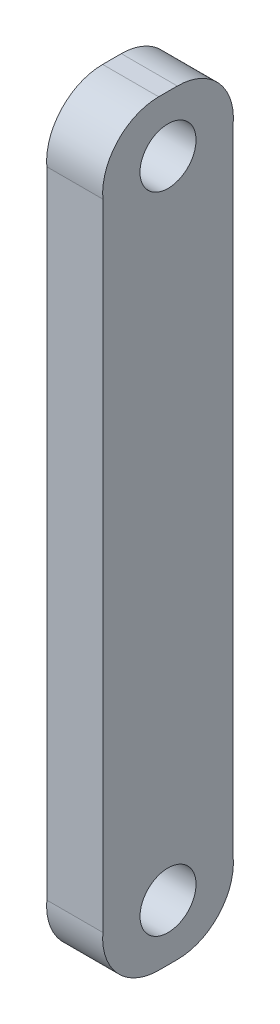
ISO-10303-21;
HEADER;
FILE_DESCRIPTION(('STEP AP214'),'2;1');
FILE_NAME('part.step','',(''),(''),'','','');
FILE_SCHEMA(('AUTOMOTIVE_DESIGN { 1 0 10303 214 1 1 1 1 }'));
ENDSEC;
DATA;
#1=APPLICATION_CONTEXT('core data for automotive mechanical design processes');
#2=APPLICATION_PROTOCOL_DEFINITION('international standard','automotive_design',2000,#1);
#3=PRODUCT_CONTEXT('',#1,'mechanical');
#4=PRODUCT('Part','Part','',(#3));
#5=PRODUCT_RELATED_PRODUCT_CATEGORY('part','',(#4));
#6=PRODUCT_DEFINITION_FORMATION('','',#4);
#7=PRODUCT_DEFINITION_CONTEXT('part definition',#1,'design');
#8=PRODUCT_DEFINITION('design','',#6,#7);
#9=PRODUCT_DEFINITION_SHAPE('','',#8);
#10=(LENGTH_UNIT() NAMED_UNIT(*) SI_UNIT(.MILLI.,.METRE.));
#11=(NAMED_UNIT(*) PLANE_ANGLE_UNIT() SI_UNIT($,.RADIAN.));
#12=(NAMED_UNIT(*) SI_UNIT($,.STERADIAN.) SOLID_ANGLE_UNIT());
#13=UNCERTAINTY_MEASURE_WITH_UNIT(LENGTH_MEASURE(1.E-05),#10,'distance_accuracy_value','');
#14=(GEOMETRIC_REPRESENTATION_CONTEXT(3) GLOBAL_UNCERTAINTY_ASSIGNED_CONTEXT((#13)) GLOBAL_UNIT_ASSIGNED_CONTEXT((#10,
#11,#12)) REPRESENTATION_CONTEXT('',''));
#15=CARTESIAN_POINT('',(0.,0.,0.));
#16=DIRECTION('',(0.,0.,1.));
#17=DIRECTION('',(1.,0.,0.));
#18=AXIS2_PLACEMENT_3D('',#15,#16,#17);
#19=CARTESIAN_POINT('',(3.,0.,0.5));
#20=DIRECTION('',(1.,0.,0.));
#21=DIRECTION('',(0.,0.,-1.));
#22=AXIS2_PLACEMENT_3D('',#19,#20,#21);
#23=PLANE('',#22);
#24=CARTESIAN_POINT('',(3.,0.,0.));
#25=DIRECTION('',(1.,0.,0.));
#26=DIRECTION('',(0.,0.,-1.));
#27=AXIS2_PLACEMENT_3D('',#24,#25,#26);
#28=CIRCLE('',#27,1.5);
#29=CARTESIAN_POINT('',(3.,0.,-1.5));
#30=VERTEX_POINT('',#29);
#31=EDGE_CURVE('E151',#30,#30,#28,.T.);
#32=ORIENTED_EDGE('',*,*,#31,.F.);
#33=EDGE_LOOP('',(#32));
#34=FACE_BOUND('',#33,.T.);
#35=CARTESIAN_POINT('',(3.,0.,0.5));
#36=DIRECTION('',(1.,0.,0.));
#37=DIRECTION('',(0.,0.,-1.));
#38=AXIS2_PLACEMENT_3D('',#35,#36,#37);
#39=CIRCLE('',#38,3.);
#40=CARTESIAN_POINT('',(3.,0.25087878083905,3.48949156836488));
#41=VERTEX_POINT('',#40);
#42=CARTESIAN_POINT('',(3.,-3.,0.499999999999969));
#43=VERTEX_POINT('',#42);
#44=EDGE_CURVE('E169',#41,#43,#39,.T.);
#45=ORIENTED_EDGE('',*,*,#44,.T.);
#46=DIRECTION('',(0.,0.,-1.));
#47=VECTOR('',#46,1.);
#48=CARTESIAN_POINT('',(3.,-3.,0.499999999999969));
#49=LINE('',#48,#47);
#50=CARTESIAN_POINT('',(3.,-3.,-0.500000000000031));
#51=VERTEX_POINT('',#50);
#52=EDGE_CURVE('E104',#43,#51,#49,.T.);
#53=ORIENTED_EDGE('',*,*,#52,.T.);
#54=CARTESIAN_POINT('',(3.,0.,-0.5));
#55=DIRECTION('',(1.,0.,0.));
#56=DIRECTION('',(0.,0.,-1.));
#57=AXIS2_PLACEMENT_3D('',#54,#55,#56);
#58=CIRCLE('',#57,3.);
#59=CARTESIAN_POINT('',(3.,0.250878780839065,-3.48949156836488));
#60=VERTEX_POINT('',#59);
#61=EDGE_CURVE('E191',#51,#60,#58,.T.);
#62=ORIENTED_EDGE('',*,*,#61,.T.);
#63=DIRECTION('',(0.,1.,0.));
#64=VECTOR('',#63,1.);
#65=CARTESIAN_POINT('',(3.,0.250878780839065,-3.48949156836488));
#66=LINE('',#65,#64);
#67=CARTESIAN_POINT('',(3.,34.2508787808391,-3.48949156836488));
#68=VERTEX_POINT('',#67);
#69=EDGE_CURVE('E205',#60,#68,#66,.T.);
#70=ORIENTED_EDGE('',*,*,#69,.T.);
#71=CARTESIAN_POINT('',(3.,34.5017575616781,-0.499999999999915));
#72=DIRECTION('',(1.,0.,0.));
#73=DIRECTION('',(0.,0.,1.));
#74=AXIS2_PLACEMENT_3D('',#71,#72,#73);
#75=CIRCLE('',#74,3.00000000000004);
#76=CARTESIAN_POINT('',(3.,37.5017575616782,-0.499999999999931));
#77=VERTEX_POINT('',#76);
#78=EDGE_CURVE('E123',#68,#77,#75,.T.);
#79=ORIENTED_EDGE('',*,*,#78,.T.);
#80=DIRECTION('',(0.,0.,1.));
#81=VECTOR('',#80,1.);
#82=CARTESIAN_POINT('',(3.,37.5017575616781,0.500000000000069));
#83=LINE('',#82,#81);
#84=CARTESIAN_POINT('',(3.,37.5017575616781,0.500000000000069));
#85=VERTEX_POINT('',#84);
#86=EDGE_CURVE('E117',#77,#85,#83,.T.);
#87=ORIENTED_EDGE('',*,*,#86,.T.);
#88=CARTESIAN_POINT('',(3.,34.5017575616781,0.500000000000086));
#89=DIRECTION('',(1.,0.,0.));
#90=DIRECTION('',(0.,0.,1.));
#91=AXIS2_PLACEMENT_3D('',#88,#89,#90);
#92=CIRCLE('',#91,2.99999999999996);
#93=CARTESIAN_POINT('',(3.,34.2508787808391,3.48949156836492));
#94=VERTEX_POINT('',#93);
#95=EDGE_CURVE('E121',#85,#94,#92,.T.);
#96=ORIENTED_EDGE('',*,*,#95,.T.);
#97=DIRECTION('',(0.,-1.,0.));
#98=VECTOR('',#97,1.);
#99=CARTESIAN_POINT('',(3.,0.25087878083905,3.48949156836488));
#100=LINE('',#99,#98);
#101=EDGE_CURVE('E61',#94,#41,#100,.T.);
#102=ORIENTED_EDGE('',*,*,#101,.T.);
#103=EDGE_LOOP('',(#45,#53,#62,#70,#79,#87,#96,#102));
#104=FACE_BOUND('',#103,.T.);
#105=CARTESIAN_POINT('',(3.,34.5017575616781,0.));
#106=DIRECTION('',(1.,0.,0.));
#107=DIRECTION('',(0.,0.,1.));
#108=AXIS2_PLACEMENT_3D('',#105,#106,#107);
#109=CIRCLE('',#108,1.5);
#110=CARTESIAN_POINT('',(3.,34.5017575616781,1.50000000000008));
#111=VERTEX_POINT('',#110);
#112=EDGE_CURVE('E220',#111,#111,#109,.T.);
#113=ORIENTED_EDGE('',*,*,#112,.F.);
#114=EDGE_LOOP('',(#113));
#115=FACE_BOUND('',#114,.T.);
#116=ADVANCED_FACE('F43',(#34,#104,#115),#23,.T.);
#117=CARTESIAN_POINT('',(0.,0.,0.5));
#118=DIRECTION('',(1.,0.,0.));
#119=DIRECTION('',(0.,0.,-1.));
#120=AXIS2_PLACEMENT_3D('',#117,#118,#119);
#121=PLANE('',#120);
#122=CARTESIAN_POINT('',(0.,0.,0.5));
#123=DIRECTION('',(1.,0.,0.));
#124=DIRECTION('',(0.,0.,-1.));
#125=AXIS2_PLACEMENT_3D('',#122,#123,#124);
#126=CIRCLE('',#125,3.);
#127=CARTESIAN_POINT('',(0.,0.25087878083905,3.48949156836488));
#128=VERTEX_POINT('',#127);
#129=CARTESIAN_POINT('',(0.,-3.,0.499999999999969));
#130=VERTEX_POINT('',#129);
#131=EDGE_CURVE('E146',#128,#130,#126,.T.);
#132=ORIENTED_EDGE('',*,*,#131,.F.);
#133=DIRECTION('',(0.,-1.,0.));
#134=VECTOR('',#133,1.);
#135=CARTESIAN_POINT('',(0.,0.25087878083905,3.48949156836488));
#136=LINE('',#135,#134);
#137=CARTESIAN_POINT('',(0.,34.2508787808391,3.48949156836492));
#138=VERTEX_POINT('',#137);
#139=EDGE_CURVE('E96',#138,#128,#136,.T.);
#140=ORIENTED_EDGE('',*,*,#139,.F.);
#141=CARTESIAN_POINT('',(0.,34.5017575616781,0.500000000000086));
#142=DIRECTION('',(1.,0.,0.));
#143=DIRECTION('',(0.,0.,1.));
#144=AXIS2_PLACEMENT_3D('',#141,#142,#143);
#145=CIRCLE('',#144,2.99999999999996);
#146=CARTESIAN_POINT('',(0.,37.5017575616781,0.500000000000069));
#147=VERTEX_POINT('',#146);
#148=EDGE_CURVE('E90',#147,#138,#145,.T.);
#149=ORIENTED_EDGE('',*,*,#148,.F.);
#150=DIRECTION('',(0.,0.,1.));
#151=VECTOR('',#150,1.);
#152=CARTESIAN_POINT('',(0.,37.5017575616781,0.500000000000069));
#153=LINE('',#152,#151);
#154=CARTESIAN_POINT('',(0.,37.5017575616782,-0.499999999999931));
#155=VERTEX_POINT('',#154);
#156=EDGE_CURVE('E132',#155,#147,#153,.T.);
#157=ORIENTED_EDGE('',*,*,#156,.F.);
#158=CARTESIAN_POINT('',(0.,34.5017575616781,-0.499999999999915));
#159=DIRECTION('',(1.,0.,0.));
#160=DIRECTION('',(0.,0.,1.));
#161=AXIS2_PLACEMENT_3D('',#158,#159,#160);
#162=CIRCLE('',#161,3.00000000000004);
#163=CARTESIAN_POINT('',(0.,34.2508787808391,-3.48949156836488));
#164=VERTEX_POINT('',#163);
#165=EDGE_CURVE('E160',#164,#155,#162,.T.);
#166=ORIENTED_EDGE('',*,*,#165,.F.);
#167=DIRECTION('',(0.,1.,0.));
#168=VECTOR('',#167,1.);
#169=CARTESIAN_POINT('',(0.,0.250878780839065,-3.48949156836488));
#170=LINE('',#169,#168);
#171=CARTESIAN_POINT('',(0.,0.250878780839065,-3.48949156836488));
#172=VERTEX_POINT('',#171);
#173=EDGE_CURVE('E157',#172,#164,#170,.T.);
#174=ORIENTED_EDGE('',*,*,#173,.F.);
#175=CARTESIAN_POINT('',(0.,0.,-0.5));
#176=DIRECTION('',(1.,0.,0.));
#177=DIRECTION('',(0.,0.,-1.));
#178=AXIS2_PLACEMENT_3D('',#175,#176,#177);
#179=CIRCLE('',#178,3.);
#180=CARTESIAN_POINT('',(0.,-3.,-0.500000000000031));
#181=VERTEX_POINT('',#180);
#182=EDGE_CURVE('E154',#181,#172,#179,.T.);
#183=ORIENTED_EDGE('',*,*,#182,.F.);
#184=DIRECTION('',(0.,0.,-1.));
#185=VECTOR('',#184,1.);
#186=CARTESIAN_POINT('',(0.,-3.,0.499999999999969));
#187=LINE('',#186,#185);
#188=EDGE_CURVE('E150',#130,#181,#187,.T.);
#189=ORIENTED_EDGE('',*,*,#188,.F.);
#190=EDGE_LOOP('',(#132,#140,#149,#157,#166,#174,#183,#189));
#191=FACE_BOUND('',#190,.T.);
#192=CARTESIAN_POINT('',(0.,0.,0.));
#193=DIRECTION('',(1.,0.,0.));
#194=DIRECTION('',(0.,0.,-1.));
#195=AXIS2_PLACEMENT_3D('',#192,#193,#194);
#196=CIRCLE('',#195,1.5);
#197=CARTESIAN_POINT('',(0.,0.,-1.5));
#198=VERTEX_POINT('',#197);
#199=EDGE_CURVE('E216',#198,#198,#196,.T.);
#200=ORIENTED_EDGE('',*,*,#199,.T.);
#201=EDGE_LOOP('',(#200));
#202=FACE_BOUND('',#201,.T.);
#203=CARTESIAN_POINT('',(0.,34.5017575616781,0.));
#204=DIRECTION('',(1.,0.,0.));
#205=DIRECTION('',(0.,0.,1.));
#206=AXIS2_PLACEMENT_3D('',#203,#204,#205);
#207=CIRCLE('',#206,1.5);
#208=CARTESIAN_POINT('',(0.,34.5017575616781,1.50000000000008));
#209=VERTEX_POINT('',#208);
#210=EDGE_CURVE('E224',#209,#209,#207,.T.);
#211=ORIENTED_EDGE('',*,*,#210,.T.);
#212=EDGE_LOOP('',(#211));
#213=FACE_BOUND('',#212,.T.);
#214=ADVANCED_FACE('F195',(#191,#202,#213),#121,.F.);
#215=CARTESIAN_POINT('',(3.,0.,0.5));
#216=DIRECTION('',(-1.,0.,0.));
#217=DIRECTION('',(0.,0.,1.));
#218=AXIS2_PLACEMENT_3D('',#215,#216,#217);
#219=CYLINDRICAL_SURFACE('',#218,3.);
#220=ORIENTED_EDGE('',*,*,#131,.T.);
#221=DIRECTION('',(-1.,0.,0.));
#222=VECTOR('',#221,1.);
#223=CARTESIAN_POINT('',(3.,-3.,0.499999999999969));
#224=LINE('',#223,#222);
#225=EDGE_CURVE('E11',#43,#130,#224,.T.);
#226=ORIENTED_EDGE('',*,*,#225,.F.);
#227=ORIENTED_EDGE('',*,*,#44,.F.);
#228=DIRECTION('',(-1.,0.,0.));
#229=VECTOR('',#228,1.);
#230=CARTESIAN_POINT('',(3.,0.25087878083905,3.48949156836488));
#231=LINE('',#230,#229);
#232=EDGE_CURVE('E142',#41,#128,#231,.T.);
#233=ORIENTED_EDGE('',*,*,#232,.T.);
#234=EDGE_LOOP('',(#220,#226,#227,#233));
#235=FACE_BOUND('',#234,.T.);
#236=ADVANCED_FACE('F45',(#235),#219,.T.);
#237=CARTESIAN_POINT('',(3.,-3.,0.499999999999969));
#238=DIRECTION('',(0.,1.,0.));
#239=DIRECTION('',(0.,0.,1.));
#240=AXIS2_PLACEMENT_3D('',#237,#238,#239);
#241=PLANE('',#240);
#242=ORIENTED_EDGE('',*,*,#188,.T.);
#243=DIRECTION('',(-1.,0.,0.));
#244=VECTOR('',#243,1.);
#245=CARTESIAN_POINT('',(3.,-3.,-0.500000000000031));
#246=LINE('',#245,#244);
#247=EDGE_CURVE('E53',#51,#181,#246,.T.);
#248=ORIENTED_EDGE('',*,*,#247,.F.);
#249=ORIENTED_EDGE('',*,*,#52,.F.);
#250=ORIENTED_EDGE('',*,*,#225,.T.);
#251=EDGE_LOOP('',(#242,#248,#249,#250));
#252=FACE_BOUND('',#251,.T.);
#253=ADVANCED_FACE('F259',(#252),#241,.F.);
#254=CARTESIAN_POINT('',(3.,0.,-0.5));
#255=DIRECTION('',(-1.,0.,0.));
#256=DIRECTION('',(0.,0.,1.));
#257=AXIS2_PLACEMENT_3D('',#254,#255,#256);
#258=CYLINDRICAL_SURFACE('',#257,3.);
#259=ORIENTED_EDGE('',*,*,#182,.T.);
#260=DIRECTION('',(-1.,0.,0.));
#261=VECTOR('',#260,1.);
#262=CARTESIAN_POINT('',(3.,0.250878780839065,-3.48949156836488));
#263=LINE('',#262,#261);
#264=EDGE_CURVE('E180',#60,#172,#263,.T.);
#265=ORIENTED_EDGE('',*,*,#264,.F.);
#266=ORIENTED_EDGE('',*,*,#61,.F.);
#267=ORIENTED_EDGE('',*,*,#247,.T.);
#268=EDGE_LOOP('',(#259,#265,#266,#267));
#269=FACE_BOUND('',#268,.T.);
#270=ADVANCED_FACE('F189',(#269),#258,.T.);
#271=CARTESIAN_POINT('',(3.,0.250878780839065,-3.48949156836488));
#272=DIRECTION('',(0.,0.,1.));
#273=DIRECTION('',(1.,0.,0.));
#274=AXIS2_PLACEMENT_3D('',#271,#272,#273);
#275=PLANE('',#274);
#276=ORIENTED_EDGE('',*,*,#173,.T.);
#277=DIRECTION('',(-1.,0.,0.));
#278=VECTOR('',#277,1.);
#279=CARTESIAN_POINT('',(3.,34.2508787808391,-3.48949156836488));
#280=LINE('',#279,#278);
#281=EDGE_CURVE('E176',#68,#164,#280,.T.);
#282=ORIENTED_EDGE('',*,*,#281,.F.);
#283=ORIENTED_EDGE('',*,*,#69,.F.);
#284=ORIENTED_EDGE('',*,*,#264,.T.);
#285=EDGE_LOOP('',(#276,#282,#283,#284));
#286=FACE_BOUND('',#285,.T.);
#287=ADVANCED_FACE('F200',(#286),#275,.F.);
#288=CARTESIAN_POINT('',(3.,34.5017575616781,-0.499999999999915));
#289=DIRECTION('',(-1.,0.,0.));
#290=DIRECTION('',(0.,0.,1.));
#291=AXIS2_PLACEMENT_3D('',#288,#289,#290);
#292=CYLINDRICAL_SURFACE('',#291,3.00000000000004);
#293=ORIENTED_EDGE('',*,*,#165,.T.);
#294=DIRECTION('',(-1.,0.,0.));
#295=VECTOR('',#294,1.);
#296=CARTESIAN_POINT('',(3.,37.5017575616782,-0.499999999999931));
#297=LINE('',#296,#295);
#298=EDGE_CURVE('E134',#77,#155,#297,.T.);
#299=ORIENTED_EDGE('',*,*,#298,.F.);
#300=ORIENTED_EDGE('',*,*,#78,.F.);
#301=ORIENTED_EDGE('',*,*,#281,.T.);
#302=EDGE_LOOP('',(#293,#299,#300,#301));
#303=FACE_BOUND('',#302,.T.);
#304=ADVANCED_FACE('F203',(#303),#292,.T.);
#305=CARTESIAN_POINT('',(3.,37.5017575616781,0.500000000000069));
#306=DIRECTION('',(0.,-1.,0.));
#307=DIRECTION('',(0.,0.,-1.));
#308=AXIS2_PLACEMENT_3D('',#305,#306,#307);
#309=PLANE('',#308);
#310=ORIENTED_EDGE('',*,*,#156,.T.);
#311=DIRECTION('',(-1.,0.,0.));
#312=VECTOR('',#311,1.);
#313=CARTESIAN_POINT('',(3.,37.5017575616781,0.500000000000069));
#314=LINE('',#313,#312);
#315=EDGE_CURVE('E129',#85,#147,#314,.T.);
#316=ORIENTED_EDGE('',*,*,#315,.F.);
#317=ORIENTED_EDGE('',*,*,#86,.F.);
#318=ORIENTED_EDGE('',*,*,#298,.T.);
#319=EDGE_LOOP('',(#310,#316,#317,#318));
#320=FACE_BOUND('',#319,.T.);
#321=ADVANCED_FACE('F130',(#320),#309,.F.);
#322=CARTESIAN_POINT('',(3.,34.5017575616781,0.500000000000086));
#323=DIRECTION('',(-1.,0.,0.));
#324=DIRECTION('',(0.,0.,1.));
#325=AXIS2_PLACEMENT_3D('',#322,#323,#324);
#326=CYLINDRICAL_SURFACE('',#325,2.99999999999996);
#327=ORIENTED_EDGE('',*,*,#148,.T.);
#328=DIRECTION('',(-1.,0.,0.));
#329=VECTOR('',#328,1.);
#330=CARTESIAN_POINT('',(3.,34.2508787808391,3.48949156836492));
#331=LINE('',#330,#329);
#332=EDGE_CURVE('E135',#94,#138,#331,.T.);
#333=ORIENTED_EDGE('',*,*,#332,.F.);
#334=ORIENTED_EDGE('',*,*,#95,.F.);
#335=ORIENTED_EDGE('',*,*,#315,.T.);
#336=EDGE_LOOP('',(#327,#333,#334,#335));
#337=FACE_BOUND('',#336,.T.);
#338=ADVANCED_FACE('F137',(#337),#326,.T.);
#339=CARTESIAN_POINT('',(3.,0.25087878083905,3.48949156836488));
#340=DIRECTION('',(0.,0.,-1.));
#341=DIRECTION('',(-1.,0.,0.));
#342=AXIS2_PLACEMENT_3D('',#339,#340,#341);
#343=PLANE('',#342);
#344=ORIENTED_EDGE('',*,*,#139,.T.);
#345=ORIENTED_EDGE('',*,*,#232,.F.);
#346=ORIENTED_EDGE('',*,*,#101,.F.);
#347=ORIENTED_EDGE('',*,*,#332,.T.);
#348=EDGE_LOOP('',(#344,#345,#346,#347));
#349=FACE_BOUND('',#348,.T.);
#350=ADVANCED_FACE('F247',(#349),#343,.F.);
#351=CARTESIAN_POINT('',(3.,0.,0.));
#352=DIRECTION('',(-1.,0.,0.));
#353=DIRECTION('',(0.,0.,1.));
#354=AXIS2_PLACEMENT_3D('',#351,#352,#353);
#355=CYLINDRICAL_SURFACE('',#354,1.5);
#356=ORIENTED_EDGE('',*,*,#31,.T.);
#357=EDGE_LOOP('',(#356));
#358=FACE_BOUND('',#357,.T.);
#359=ORIENTED_EDGE('',*,*,#199,.F.);
#360=EDGE_LOOP('',(#359));
#361=FACE_BOUND('',#360,.T.);
#362=ADVANCED_FACE('F244',(#358,#361),#355,.F.);
#363=CARTESIAN_POINT('',(3.,34.5017575616781,0.));
#364=DIRECTION('',(-1.,0.,0.));
#365=DIRECTION('',(0.,0.,1.));
#366=AXIS2_PLACEMENT_3D('',#363,#364,#365);
#367=CYLINDRICAL_SURFACE('',#366,1.5);
#368=ORIENTED_EDGE('',*,*,#112,.T.);
#369=EDGE_LOOP('',(#368));
#370=FACE_BOUND('',#369,.T.);
#371=ORIENTED_EDGE('',*,*,#210,.F.);
#372=EDGE_LOOP('',(#371));
#373=FACE_BOUND('',#372,.T.);
#374=ADVANCED_FACE('F233',(#370,#373),#367,.F.);
#375=CLOSED_SHELL('',(#116,#214,#236,#253,#270,#287,#304,#321,#338,#350,#362,#374));
#376=MANIFOLD_SOLID_BREP('B2',#375);
#377=ADVANCED_BREP_SHAPE_REPRESENTATION('',(#18,#376),#14);
#378=SHAPE_DEFINITION_REPRESENTATION(#9,#377);
ENDSEC;
END-ISO-10303-21;
